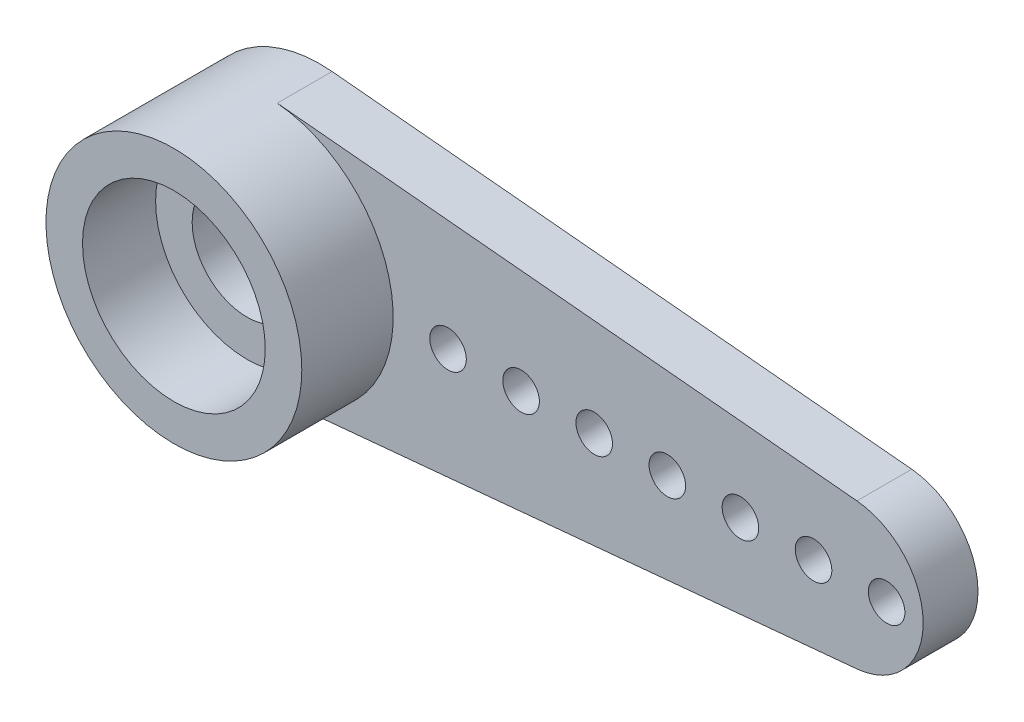
ISO-10303-21;
HEADER;
FILE_DESCRIPTION(('STEP AP214'),'2;1');
FILE_NAME('part.step','',(''),(''),'','','');
FILE_SCHEMA(('AUTOMOTIVE_DESIGN { 1 0 10303 214 1 1 1 1 }'));
ENDSEC;
DATA;
#1=APPLICATION_CONTEXT('core data for automotive mechanical design processes');
#2=APPLICATION_PROTOCOL_DEFINITION('international standard','automotive_design',2000,#1);
#3=PRODUCT_CONTEXT('',#1,'mechanical');
#4=PRODUCT('Part','Part','',(#3));
#5=PRODUCT_RELATED_PRODUCT_CATEGORY('part','',(#4));
#6=PRODUCT_DEFINITION_FORMATION('','',#4);
#7=PRODUCT_DEFINITION_CONTEXT('part definition',#1,'design');
#8=PRODUCT_DEFINITION('design','',#6,#7);
#9=PRODUCT_DEFINITION_SHAPE('','',#8);
#10=(LENGTH_UNIT() NAMED_UNIT(*) SI_UNIT(.MILLI.,.METRE.));
#11=(NAMED_UNIT(*) PLANE_ANGLE_UNIT() SI_UNIT($,.RADIAN.));
#12=(NAMED_UNIT(*) SI_UNIT($,.STERADIAN.) SOLID_ANGLE_UNIT());
#13=UNCERTAINTY_MEASURE_WITH_UNIT(LENGTH_MEASURE(1.E-05),#10,'distance_accuracy_value','');
#14=(GEOMETRIC_REPRESENTATION_CONTEXT(3) GLOBAL_UNCERTAINTY_ASSIGNED_CONTEXT((#13)) GLOBAL_UNIT_ASSIGNED_CONTEXT((#10,
#11,#12)) REPRESENTATION_CONTEXT('',''));
#15=CARTESIAN_POINT('',(0.,0.,0.));
#16=DIRECTION('',(0.,0.,1.));
#17=DIRECTION('',(1.,0.,0.));
#18=AXIS2_PLACEMENT_3D('',#15,#16,#17);
#19=CARTESIAN_POINT('',(0.,0.,-55.));
#20=DIRECTION('',(0.,0.,1.));
#21=DIRECTION('',(-1.,0.,0.));
#22=AXIS2_PLACEMENT_3D('',#19,#20,#21);
#23=CYLINDRICAL_SURFACE('',#22,1.5);
#24=CARTESIAN_POINT('',(0.,0.,-2.));
#25=DIRECTION('',(0.,0.,-1.));
#26=DIRECTION('',(-1.,0.,0.));
#27=AXIS2_PLACEMENT_3D('',#24,#25,#26);
#28=CIRCLE('',#27,1.5);
#29=CARTESIAN_POINT('',(-1.5,0.,-2.));
#30=VERTEX_POINT('',#29);
#31=EDGE_CURVE('E115',#30,#30,#28,.F.);
#32=ORIENTED_EDGE('',*,*,#31,.T.);
#33=EDGE_LOOP('',(#32));
#34=FACE_BOUND('',#33,.T.);
#35=CARTESIAN_POINT('',(0.,0.,-3.));
#36=DIRECTION('',(0.,0.,1.));
#37=DIRECTION('',(1.,0.,0.));
#38=AXIS2_PLACEMENT_3D('',#35,#36,#37);
#39=CIRCLE('',#38,1.5);
#40=CARTESIAN_POINT('',(1.5,0.,-3.));
#41=VERTEX_POINT('',#40);
#42=EDGE_CURVE('E41',#41,#41,#39,.F.);
#43=ORIENTED_EDGE('',*,*,#42,.T.);
#44=EDGE_LOOP('',(#43));
#45=FACE_BOUND('',#44,.T.);
#46=ADVANCED_FACE('F37',(#34,#45),#23,.F.);
#47=CARTESIAN_POINT('',(0.,0.,-4.));
#48=DIRECTION('',(0.,0.,1.));
#49=DIRECTION('',(-1.,0.,0.));
#50=AXIS2_PLACEMENT_3D('',#47,#48,#49);
#51=CYLINDRICAL_SURFACE('',#50,3.5);
#52=CARTESIAN_POINT('',(0.,0.,-4.));
#53=DIRECTION('',(0.,0.,1.));
#54=DIRECTION('',(1.,0.,0.));
#55=AXIS2_PLACEMENT_3D('',#52,#53,#54);
#56=CIRCLE('',#55,3.5);
#57=CARTESIAN_POINT('',(0.328125,3.48458519545369,-4.));
#58=VERTEX_POINT('',#57);
#59=CARTESIAN_POINT('',(0.328125,-3.48458519545369,-4.));
#60=VERTEX_POINT('',#59);
#61=EDGE_CURVE('E11',#58,#60,#56,.T.);
#62=ORIENTED_EDGE('',*,*,#61,.T.);
#63=DIRECTION('',(0.,0.,-1.));
#64=VECTOR('',#63,1.);
#65=CARTESIAN_POINT('',(0.328125,-3.48458519545369,-2.5));
#66=LINE('',#65,#64);
#67=CARTESIAN_POINT('',(0.328125,-3.48458519545369,-2.5));
#68=VERTEX_POINT('',#67);
#69=EDGE_CURVE('E98',#68,#60,#66,.T.);
#70=ORIENTED_EDGE('',*,*,#69,.F.);
#71=CARTESIAN_POINT('',(0.,0.,-2.5));
#72=DIRECTION('',(0.,0.,-1.));
#73=DIRECTION('',(1.,0.,0.));
#74=AXIS2_PLACEMENT_3D('',#71,#72,#73);
#75=CIRCLE('',#74,3.5);
#76=CARTESIAN_POINT('',(0.328125,3.48458519545369,-2.5));
#77=VERTEX_POINT('',#76);
#78=EDGE_CURVE('E89',#77,#68,#75,.T.);
#79=ORIENTED_EDGE('',*,*,#78,.F.);
#80=DIRECTION('',(0.,0.,-1.));
#81=VECTOR('',#80,1.);
#82=CARTESIAN_POINT('',(0.328125,3.48458519545369,-2.5));
#83=LINE('',#82,#81);
#84=EDGE_CURVE('E110',#77,#58,#83,.T.);
#85=ORIENTED_EDGE('',*,*,#84,.T.);
#86=EDGE_LOOP('',(#62,#70,#79,#85));
#87=FACE_BOUND('',#86,.T.);
#88=CARTESIAN_POINT('',(0.,0.,0.));
#89=DIRECTION('',(0.,0.,1.));
#90=DIRECTION('',(1.,0.,0.));
#91=AXIS2_PLACEMENT_3D('',#88,#89,#90);
#92=CIRCLE('',#91,3.5);
#93=CARTESIAN_POINT('',(3.5,0.,0.));
#94=VERTEX_POINT('',#93);
#95=EDGE_CURVE('E46',#94,#94,#92,.T.);
#96=ORIENTED_EDGE('',*,*,#95,.F.);
#97=EDGE_LOOP('',(#96));
#98=FACE_BOUND('',#97,.T.);
#99=ADVANCED_FACE('F39',(#87,#98),#51,.T.);
#100=CARTESIAN_POINT('',(0.,0.,-4.));
#101=DIRECTION('',(0.,0.,-1.));
#102=DIRECTION('',(1.,0.,0.));
#103=AXIS2_PLACEMENT_3D('',#100,#101,#102);
#104=PLANE('',#103);
#105=CARTESIAN_POINT('',(0.,0.,-4.));
#106=DIRECTION('',(0.,0.,1.));
#107=DIRECTION('',(1.,0.,0.));
#108=AXIS2_PLACEMENT_3D('',#105,#106,#107);
#109=CIRCLE('',#108,2.5);
#110=CARTESIAN_POINT('',(2.5,0.,-4.));
#111=VERTEX_POINT('',#110);
#112=EDGE_CURVE('E132',#111,#111,#109,.T.);
#113=ORIENTED_EDGE('',*,*,#112,.T.);
#114=EDGE_LOOP('',(#113));
#115=FACE_BOUND('',#114,.T.);
#116=CARTESIAN_POINT('',(17.,0.,-4.));
#117=DIRECTION('',(0.,0.,-1.));
#118=DIRECTION('',(-1.,0.,0.));
#119=AXIS2_PLACEMENT_3D('',#116,#117,#118);
#120=CIRCLE('',#119,0.500000000000002);
#121=CARTESIAN_POINT('',(16.5,0.,-4.));
#122=VERTEX_POINT('',#121);
#123=EDGE_CURVE('E122',#122,#122,#120,.T.);
#124=ORIENTED_EDGE('',*,*,#123,.F.);
#125=EDGE_LOOP('',(#124));
#126=FACE_BOUND('',#125,.T.);
#127=CARTESIAN_POINT('',(15.,0.,-4.));
#128=DIRECTION('',(0.,0.,-1.));
#129=DIRECTION('',(-1.,0.,0.));
#130=AXIS2_PLACEMENT_3D('',#127,#128,#129);
#131=CIRCLE('',#130,0.499999999999999);
#132=CARTESIAN_POINT('',(14.5,0.,-4.));
#133=VERTEX_POINT('',#132);
#134=EDGE_CURVE('E142',#133,#133,#131,.T.);
#135=ORIENTED_EDGE('',*,*,#134,.F.);
#136=EDGE_LOOP('',(#135));
#137=FACE_BOUND('',#136,.T.);
#138=CARTESIAN_POINT('',(5.,0.,-4.));
#139=DIRECTION('',(0.,0.,-1.));
#140=DIRECTION('',(-1.,0.,0.));
#141=AXIS2_PLACEMENT_3D('',#138,#139,#140);
#142=CIRCLE('',#141,0.500000000000001);
#143=CARTESIAN_POINT('',(4.5,0.,-4.));
#144=VERTEX_POINT('',#143);
#145=EDGE_CURVE('E135',#144,#144,#142,.T.);
#146=ORIENTED_EDGE('',*,*,#145,.F.);
#147=EDGE_LOOP('',(#146));
#148=FACE_BOUND('',#147,.T.);
#149=CARTESIAN_POINT('',(13.,0.,-4.));
#150=DIRECTION('',(0.,0.,-1.));
#151=DIRECTION('',(-1.,0.,0.));
#152=AXIS2_PLACEMENT_3D('',#149,#150,#151);
#153=CIRCLE('',#152,0.500000000000002);
#154=CARTESIAN_POINT('',(12.5,0.,-4.));
#155=VERTEX_POINT('',#154);
#156=EDGE_CURVE('E163',#155,#155,#153,.T.);
#157=ORIENTED_EDGE('',*,*,#156,.F.);
#158=EDGE_LOOP('',(#157));
#159=FACE_BOUND('',#158,.T.);
#160=CARTESIAN_POINT('',(11.,0.,-4.));
#161=DIRECTION('',(0.,0.,-1.));
#162=DIRECTION('',(-1.,0.,0.));
#163=AXIS2_PLACEMENT_3D('',#160,#161,#162);
#164=CIRCLE('',#163,0.499999999999999);
#165=CARTESIAN_POINT('',(10.5,0.,-4.));
#166=VERTEX_POINT('',#165);
#167=EDGE_CURVE('E157',#166,#166,#164,.T.);
#168=ORIENTED_EDGE('',*,*,#167,.F.);
#169=EDGE_LOOP('',(#168));
#170=FACE_BOUND('',#169,.T.);
#171=CARTESIAN_POINT('',(9.,0.,-4.));
#172=DIRECTION('',(0.,0.,-1.));
#173=DIRECTION('',(-1.,0.,0.));
#174=AXIS2_PLACEMENT_3D('',#171,#172,#173);
#175=CIRCLE('',#174,0.500000000000002);
#176=CARTESIAN_POINT('',(8.5,0.,-4.));
#177=VERTEX_POINT('',#176);
#178=EDGE_CURVE('E150',#177,#177,#175,.T.);
#179=ORIENTED_EDGE('',*,*,#178,.F.);
#180=EDGE_LOOP('',(#179));
#181=FACE_BOUND('',#180,.T.);
#182=CARTESIAN_POINT('',(7.,0.,-4.));
#183=DIRECTION('',(0.,0.,-1.));
#184=DIRECTION('',(-1.,0.,0.));
#185=AXIS2_PLACEMENT_3D('',#182,#183,#184);
#186=CIRCLE('',#185,0.500000000000001);
#187=CARTESIAN_POINT('',(6.5,0.,-4.));
#188=VERTEX_POINT('',#187);
#189=EDGE_CURVE('E107',#188,#188,#186,.T.);
#190=ORIENTED_EDGE('',*,*,#189,.F.);
#191=EDGE_LOOP('',(#190));
#192=FACE_BOUND('',#191,.T.);
#193=ORIENTED_EDGE('',*,*,#61,.F.);
#194=DIRECTION('',(-0.995595770129625,0.09375,0.));
#195=VECTOR('',#194,1.);
#196=CARTESIAN_POINT('',(0.328125,3.48458519545369,-4.));
#197=LINE('',#196,#195);
#198=CARTESIAN_POINT('',(16.1875,1.99119154025925,-4.));
#199=VERTEX_POINT('',#198);
#200=EDGE_CURVE('E54',#199,#58,#197,.T.);
#201=ORIENTED_EDGE('',*,*,#200,.F.);
#202=CARTESIAN_POINT('',(16.,0.,-4.));
#203=DIRECTION('',(0.,0.,1.));
#204=DIRECTION('',(1.,0.,0.));
#205=AXIS2_PLACEMENT_3D('',#202,#203,#204);
#206=CIRCLE('',#205,2.);
#207=CARTESIAN_POINT('',(16.1875,-1.99119154025925,-4.));
#208=VERTEX_POINT('',#207);
#209=EDGE_CURVE('E106',#208,#199,#206,.T.);
#210=ORIENTED_EDGE('',*,*,#209,.F.);
#211=DIRECTION('',(0.995595770129625,0.0937500000000001,0.));
#212=VECTOR('',#211,1.);
#213=CARTESIAN_POINT('',(16.1875,-1.99119154025925,-4.));
#214=LINE('',#213,#212);
#215=EDGE_CURVE('E95',#60,#208,#214,.T.);
#216=ORIENTED_EDGE('',*,*,#215,.F.);
#217=EDGE_LOOP('',(#193,#201,#210,#216));
#218=FACE_BOUND('',#217,.T.);
#219=ADVANCED_FACE('F194',(#115,#126,#137,#148,#159,#170,#181,#192,#218),#104,.T.);
#220=CARTESIAN_POINT('',(0.,0.,0.));
#221=DIRECTION('',(0.,0.,-1.));
#222=DIRECTION('',(1.,0.,0.));
#223=AXIS2_PLACEMENT_3D('',#220,#221,#222);
#224=PLANE('',#223);
#225=CARTESIAN_POINT('',(0.,0.,0.));
#226=DIRECTION('',(0.,0.,-1.));
#227=DIRECTION('',(-1.,0.,0.));
#228=AXIS2_PLACEMENT_3D('',#225,#226,#227);
#229=CIRCLE('',#228,2.5);
#230=CARTESIAN_POINT('',(-2.5,0.,0.));
#231=VERTEX_POINT('',#230);
#232=EDGE_CURVE('E125',#231,#231,#229,.T.);
#233=ORIENTED_EDGE('',*,*,#232,.T.);
#234=EDGE_LOOP('',(#233));
#235=FACE_BOUND('',#234,.T.);
#236=ORIENTED_EDGE('',*,*,#95,.T.);
#237=EDGE_LOOP('',(#236));
#238=FACE_BOUND('',#237,.T.);
#239=ADVANCED_FACE('F234',(#235,#238),#224,.F.);
#240=CARTESIAN_POINT('',(0.328125,3.48458519545369,-2.5));
#241=DIRECTION('',(0.09375,0.995595770129624,0.));
#242=DIRECTION('',(-0.995595770129625,0.09375,0.));
#243=AXIS2_PLACEMENT_3D('',#240,#241,#242);
#244=PLANE('',#243);
#245=ORIENTED_EDGE('',*,*,#200,.T.);
#246=ORIENTED_EDGE('',*,*,#84,.F.);
#247=DIRECTION('',(-0.995595770129625,0.09375,0.));
#248=VECTOR('',#247,1.);
#249=CARTESIAN_POINT('',(0.328125,3.48458519545369,-2.5));
#250=LINE('',#249,#248);
#251=CARTESIAN_POINT('',(16.1875,1.99119154025925,-2.5));
#252=VERTEX_POINT('',#251);
#253=EDGE_CURVE('E63',#252,#77,#250,.T.);
#254=ORIENTED_EDGE('',*,*,#253,.F.);
#255=DIRECTION('',(0.,0.,-1.));
#256=VECTOR('',#255,1.);
#257=CARTESIAN_POINT('',(16.1875,1.99119154025925,-2.5));
#258=LINE('',#257,#256);
#259=EDGE_CURVE('E76',#252,#199,#258,.T.);
#260=ORIENTED_EDGE('',*,*,#259,.T.);
#261=EDGE_LOOP('',(#245,#246,#254,#260));
#262=FACE_BOUND('',#261,.T.);
#263=ADVANCED_FACE('F245',(#262),#244,.T.);
#264=CARTESIAN_POINT('',(16.,0.,-2.5));
#265=DIRECTION('',(0.,0.,-1.));
#266=DIRECTION('',(1.,0.,0.));
#267=AXIS2_PLACEMENT_3D('',#264,#265,#266);
#268=CYLINDRICAL_SURFACE('',#267,2.);
#269=ORIENTED_EDGE('',*,*,#209,.T.);
#270=ORIENTED_EDGE('',*,*,#259,.F.);
#271=CARTESIAN_POINT('',(16.,0.,-2.5));
#272=DIRECTION('',(0.,0.,1.));
#273=DIRECTION('',(1.,0.,0.));
#274=AXIS2_PLACEMENT_3D('',#271,#272,#273);
#275=CIRCLE('',#274,2.);
#276=CARTESIAN_POINT('',(16.1875,-1.99119154025925,-2.5));
#277=VERTEX_POINT('',#276);
#278=EDGE_CURVE('E87',#277,#252,#275,.T.);
#279=ORIENTED_EDGE('',*,*,#278,.F.);
#280=DIRECTION('',(0.,0.,-1.));
#281=VECTOR('',#280,1.);
#282=CARTESIAN_POINT('',(16.1875,-1.99119154025925,-2.5));
#283=LINE('',#282,#281);
#284=EDGE_CURVE('E93',#277,#208,#283,.T.);
#285=ORIENTED_EDGE('',*,*,#284,.T.);
#286=EDGE_LOOP('',(#269,#270,#279,#285));
#287=FACE_BOUND('',#286,.T.);
#288=ADVANCED_FACE('F100',(#287),#268,.T.);
#289=CARTESIAN_POINT('',(16.1875,-1.99119154025925,-2.5));
#290=DIRECTION('',(0.09375,-0.995595770129624,0.));
#291=DIRECTION('',(0.995595770129625,0.0937500000000001,0.));
#292=AXIS2_PLACEMENT_3D('',#289,#290,#291);
#293=PLANE('',#292);
#294=ORIENTED_EDGE('',*,*,#215,.T.);
#295=ORIENTED_EDGE('',*,*,#284,.F.);
#296=DIRECTION('',(0.995595770129625,0.0937500000000001,0.));
#297=VECTOR('',#296,1.);
#298=CARTESIAN_POINT('',(16.1875,-1.99119154025925,-2.5));
#299=LINE('',#298,#297);
#300=EDGE_CURVE('E84',#68,#277,#299,.T.);
#301=ORIENTED_EDGE('',*,*,#300,.F.);
#302=ORIENTED_EDGE('',*,*,#69,.T.);
#303=EDGE_LOOP('',(#294,#295,#301,#302));
#304=FACE_BOUND('',#303,.T.);
#305=ADVANCED_FACE('F94',(#304),#293,.T.);
#306=CARTESIAN_POINT('',(0.,0.,-2.5));
#307=DIRECTION('',(0.,0.,-1.));
#308=DIRECTION('',(1.,0.,0.));
#309=AXIS2_PLACEMENT_3D('',#306,#307,#308);
#310=PLANE('',#309);
#311=CARTESIAN_POINT('',(17.,0.,-2.5));
#312=DIRECTION('',(0.,0.,-1.));
#313=DIRECTION('',(-1.,0.,0.));
#314=AXIS2_PLACEMENT_3D('',#311,#312,#313);
#315=CIRCLE('',#314,0.500000000000002);
#316=CARTESIAN_POINT('',(16.5,0.,-2.5));
#317=VERTEX_POINT('',#316);
#318=EDGE_CURVE('E117',#317,#317,#315,.T.);
#319=ORIENTED_EDGE('',*,*,#318,.T.);
#320=EDGE_LOOP('',(#319));
#321=FACE_BOUND('',#320,.T.);
#322=CARTESIAN_POINT('',(15.,0.,-2.5));
#323=DIRECTION('',(0.,0.,-1.));
#324=DIRECTION('',(-1.,0.,0.));
#325=AXIS2_PLACEMENT_3D('',#322,#323,#324);
#326=CIRCLE('',#325,0.499999999999999);
#327=CARTESIAN_POINT('',(14.5,0.,-2.5));
#328=VERTEX_POINT('',#327);
#329=EDGE_CURVE('E145',#328,#328,#326,.T.);
#330=ORIENTED_EDGE('',*,*,#329,.T.);
#331=EDGE_LOOP('',(#330));
#332=FACE_BOUND('',#331,.T.);
#333=CARTESIAN_POINT('',(5.,0.,-2.5));
#334=DIRECTION('',(0.,0.,-1.));
#335=DIRECTION('',(-1.,0.,0.));
#336=AXIS2_PLACEMENT_3D('',#333,#334,#335);
#337=CIRCLE('',#336,0.500000000000001);
#338=CARTESIAN_POINT('',(4.5,0.,-2.5));
#339=VERTEX_POINT('',#338);
#340=EDGE_CURVE('E139',#339,#339,#337,.T.);
#341=ORIENTED_EDGE('',*,*,#340,.T.);
#342=EDGE_LOOP('',(#341));
#343=FACE_BOUND('',#342,.T.);
#344=CARTESIAN_POINT('',(13.,0.,-2.5));
#345=DIRECTION('',(0.,0.,-1.));
#346=DIRECTION('',(-1.,0.,0.));
#347=AXIS2_PLACEMENT_3D('',#344,#345,#346);
#348=CIRCLE('',#347,0.500000000000002);
#349=CARTESIAN_POINT('',(12.5,0.,-2.5));
#350=VERTEX_POINT('',#349);
#351=EDGE_CURVE('E138',#350,#350,#348,.T.);
#352=ORIENTED_EDGE('',*,*,#351,.T.);
#353=EDGE_LOOP('',(#352));
#354=FACE_BOUND('',#353,.T.);
#355=CARTESIAN_POINT('',(11.,0.,-2.5));
#356=DIRECTION('',(0.,0.,-1.));
#357=DIRECTION('',(-1.,0.,0.));
#358=AXIS2_PLACEMENT_3D('',#355,#356,#357);
#359=CIRCLE('',#358,0.499999999999999);
#360=CARTESIAN_POINT('',(10.5,0.,-2.5));
#361=VERTEX_POINT('',#360);
#362=EDGE_CURVE('E160',#361,#361,#359,.T.);
#363=ORIENTED_EDGE('',*,*,#362,.T.);
#364=EDGE_LOOP('',(#363));
#365=FACE_BOUND('',#364,.T.);
#366=CARTESIAN_POINT('',(9.,0.,-2.5));
#367=DIRECTION('',(0.,0.,-1.));
#368=DIRECTION('',(-1.,0.,0.));
#369=AXIS2_PLACEMENT_3D('',#366,#367,#368);
#370=CIRCLE('',#369,0.500000000000002);
#371=CARTESIAN_POINT('',(8.5,0.,-2.5));
#372=VERTEX_POINT('',#371);
#373=EDGE_CURVE('E154',#372,#372,#370,.T.);
#374=ORIENTED_EDGE('',*,*,#373,.T.);
#375=EDGE_LOOP('',(#374));
#376=FACE_BOUND('',#375,.T.);
#377=CARTESIAN_POINT('',(7.,0.,-2.5));
#378=DIRECTION('',(0.,0.,-1.));
#379=DIRECTION('',(-1.,0.,0.));
#380=AXIS2_PLACEMENT_3D('',#377,#378,#379);
#381=CIRCLE('',#380,0.500000000000001);
#382=CARTESIAN_POINT('',(6.5,0.,-2.5));
#383=VERTEX_POINT('',#382);
#384=EDGE_CURVE('E153',#383,#383,#381,.T.);
#385=ORIENTED_EDGE('',*,*,#384,.T.);
#386=EDGE_LOOP('',(#385));
#387=FACE_BOUND('',#386,.T.);
#388=ORIENTED_EDGE('',*,*,#78,.T.);
#389=ORIENTED_EDGE('',*,*,#300,.T.);
#390=ORIENTED_EDGE('',*,*,#278,.T.);
#391=ORIENTED_EDGE('',*,*,#253,.T.);
#392=EDGE_LOOP('',(#388,#389,#390,#391));
#393=FACE_BOUND('',#392,.T.);
#394=ADVANCED_FACE('F85',(#321,#332,#343,#354,#365,#376,#387,#393),#310,.F.);
#395=CARTESIAN_POINT('',(7.,0.,-4.));
#396=DIRECTION('',(0.,0.,1.));
#397=DIRECTION('',(-1.,0.,0.));
#398=AXIS2_PLACEMENT_3D('',#395,#396,#397);
#399=CYLINDRICAL_SURFACE('',#398,0.500000000000001);
#400=ORIENTED_EDGE('',*,*,#189,.T.);
#401=EDGE_LOOP('',(#400));
#402=FACE_BOUND('',#401,.T.);
#403=ORIENTED_EDGE('',*,*,#384,.F.);
#404=EDGE_LOOP('',(#403));
#405=FACE_BOUND('',#404,.T.);
#406=ADVANCED_FACE('F174',(#402,#405),#399,.F.);
#407=CARTESIAN_POINT('',(9.,0.,-4.));
#408=DIRECTION('',(0.,0.,1.));
#409=DIRECTION('',(-1.,0.,0.));
#410=AXIS2_PLACEMENT_3D('',#407,#408,#409);
#411=CYLINDRICAL_SURFACE('',#410,0.500000000000002);
#412=ORIENTED_EDGE('',*,*,#178,.T.);
#413=EDGE_LOOP('',(#412));
#414=FACE_BOUND('',#413,.T.);
#415=ORIENTED_EDGE('',*,*,#373,.F.);
#416=EDGE_LOOP('',(#415));
#417=FACE_BOUND('',#416,.T.);
#418=ADVANCED_FACE('F176',(#414,#417),#411,.F.);
#419=CARTESIAN_POINT('',(11.,0.,-4.));
#420=DIRECTION('',(0.,0.,1.));
#421=DIRECTION('',(-1.,0.,0.));
#422=AXIS2_PLACEMENT_3D('',#419,#420,#421);
#423=CYLINDRICAL_SURFACE('',#422,0.499999999999999);
#424=ORIENTED_EDGE('',*,*,#167,.T.);
#425=EDGE_LOOP('',(#424));
#426=FACE_BOUND('',#425,.T.);
#427=ORIENTED_EDGE('',*,*,#362,.F.);
#428=EDGE_LOOP('',(#427));
#429=FACE_BOUND('',#428,.T.);
#430=ADVANCED_FACE('F183',(#426,#429),#423,.F.);
#431=CARTESIAN_POINT('',(13.,0.,-4.));
#432=DIRECTION('',(0.,0.,1.));
#433=DIRECTION('',(-1.,0.,0.));
#434=AXIS2_PLACEMENT_3D('',#431,#432,#433);
#435=CYLINDRICAL_SURFACE('',#434,0.500000000000002);
#436=ORIENTED_EDGE('',*,*,#156,.T.);
#437=EDGE_LOOP('',(#436));
#438=FACE_BOUND('',#437,.T.);
#439=ORIENTED_EDGE('',*,*,#351,.F.);
#440=EDGE_LOOP('',(#439));
#441=FACE_BOUND('',#440,.T.);
#442=ADVANCED_FACE('F205',(#438,#441),#435,.F.);
#443=CARTESIAN_POINT('',(5.,0.,-4.));
#444=DIRECTION('',(0.,0.,1.));
#445=DIRECTION('',(-1.,0.,0.));
#446=AXIS2_PLACEMENT_3D('',#443,#444,#445);
#447=CYLINDRICAL_SURFACE('',#446,0.500000000000001);
#448=ORIENTED_EDGE('',*,*,#145,.T.);
#449=EDGE_LOOP('',(#448));
#450=FACE_BOUND('',#449,.T.);
#451=ORIENTED_EDGE('',*,*,#340,.F.);
#452=EDGE_LOOP('',(#451));
#453=FACE_BOUND('',#452,.T.);
#454=ADVANCED_FACE('F201',(#450,#453),#447,.F.);
#455=CARTESIAN_POINT('',(15.,0.,-4.));
#456=DIRECTION('',(0.,0.,1.));
#457=DIRECTION('',(-1.,0.,0.));
#458=AXIS2_PLACEMENT_3D('',#455,#456,#457);
#459=CYLINDRICAL_SURFACE('',#458,0.499999999999999);
#460=ORIENTED_EDGE('',*,*,#134,.T.);
#461=EDGE_LOOP('',(#460));
#462=FACE_BOUND('',#461,.T.);
#463=ORIENTED_EDGE('',*,*,#329,.F.);
#464=EDGE_LOOP('',(#463));
#465=FACE_BOUND('',#464,.T.);
#466=ADVANCED_FACE('F204',(#462,#465),#459,.F.);
#467=CARTESIAN_POINT('',(17.,0.,-4.));
#468=DIRECTION('',(0.,0.,1.));
#469=DIRECTION('',(-1.,0.,0.));
#470=AXIS2_PLACEMENT_3D('',#467,#468,#469);
#471=CYLINDRICAL_SURFACE('',#470,0.500000000000002);
#472=ORIENTED_EDGE('',*,*,#123,.T.);
#473=EDGE_LOOP('',(#472));
#474=FACE_BOUND('',#473,.T.);
#475=ORIENTED_EDGE('',*,*,#318,.F.);
#476=EDGE_LOOP('',(#475));
#477=FACE_BOUND('',#476,.T.);
#478=ADVANCED_FACE('F209',(#474,#477),#471,.F.);
#479=CARTESIAN_POINT('',(0.,0.,-2.));
#480=DIRECTION('',(0.,0.,1.));
#481=DIRECTION('',(-1.,0.,0.));
#482=AXIS2_PLACEMENT_3D('',#479,#480,#481);
#483=PLANE('',#482);
#484=CARTESIAN_POINT('',(0.,0.,-2.));
#485=DIRECTION('',(0.,0.,-1.));
#486=DIRECTION('',(-1.,0.,0.));
#487=AXIS2_PLACEMENT_3D('',#484,#485,#486);
#488=CIRCLE('',#487,2.5);
#489=CARTESIAN_POINT('',(-2.5,0.,-2.));
#490=VERTEX_POINT('',#489);
#491=EDGE_CURVE('E118',#490,#490,#488,.T.);
#492=ORIENTED_EDGE('',*,*,#491,.F.);
#493=EDGE_LOOP('',(#492));
#494=FACE_BOUND('',#493,.T.);
#495=ORIENTED_EDGE('',*,*,#31,.F.);
#496=EDGE_LOOP('',(#495));
#497=FACE_BOUND('',#496,.T.);
#498=ADVANCED_FACE('F212',(#494,#497),#483,.T.);
#499=CARTESIAN_POINT('',(0.,0.,-2.));
#500=DIRECTION('',(0.,0.,1.));
#501=DIRECTION('',(-1.,0.,0.));
#502=AXIS2_PLACEMENT_3D('',#499,#500,#501);
#503=CYLINDRICAL_SURFACE('',#502,2.5);
#504=ORIENTED_EDGE('',*,*,#491,.T.);
#505=EDGE_LOOP('',(#504));
#506=FACE_BOUND('',#505,.T.);
#507=ORIENTED_EDGE('',*,*,#232,.F.);
#508=EDGE_LOOP('',(#507));
#509=FACE_BOUND('',#508,.T.);
#510=ADVANCED_FACE('F199',(#506,#509),#503,.F.);
#511=CARTESIAN_POINT('',(0.,0.,-3.));
#512=DIRECTION('',(0.,0.,-1.));
#513=DIRECTION('',(1.,0.,0.));
#514=AXIS2_PLACEMENT_3D('',#511,#512,#513);
#515=PLANE('',#514);
#516=CARTESIAN_POINT('',(0.,0.,-3.));
#517=DIRECTION('',(0.,0.,1.));
#518=DIRECTION('',(1.,0.,0.));
#519=AXIS2_PLACEMENT_3D('',#516,#517,#518);
#520=CIRCLE('',#519,2.5);
#521=CARTESIAN_POINT('',(2.5,0.,-3.));
#522=VERTEX_POINT('',#521);
#523=EDGE_CURVE('E344',#522,#522,#520,.T.);
#524=ORIENTED_EDGE('',*,*,#523,.F.);
#525=EDGE_LOOP('',(#524));
#526=FACE_BOUND('',#525,.T.);
#527=ORIENTED_EDGE('',*,*,#42,.F.);
#528=EDGE_LOOP('',(#527));
#529=FACE_BOUND('',#528,.T.);
#530=ADVANCED_FACE('F319',(#526,#529),#515,.T.);
#531=CARTESIAN_POINT('',(0.,0.,-3.));
#532=DIRECTION('',(0.,0.,-1.));
#533=DIRECTION('',(1.,0.,0.));
#534=AXIS2_PLACEMENT_3D('',#531,#532,#533);
#535=CYLINDRICAL_SURFACE('',#534,2.5);
#536=ORIENTED_EDGE('',*,*,#523,.T.);
#537=EDGE_LOOP('',(#536));
#538=FACE_BOUND('',#537,.T.);
#539=ORIENTED_EDGE('',*,*,#112,.F.);
#540=EDGE_LOOP('',(#539));
#541=FACE_BOUND('',#540,.T.);
#542=ADVANCED_FACE('F327',(#538,#541),#535,.F.);
#543=CLOSED_SHELL('',(#46,#99,#219,#239,#263,#288,#305,#394,#406,#418,#430,#442,#454,#466,#478,
#498,#510,#530,#542));
#544=MANIFOLD_SOLID_BREP('B2',#543);
#545=ADVANCED_BREP_SHAPE_REPRESENTATION('',(#18,#544),#14);
#546=SHAPE_DEFINITION_REPRESENTATION(#9,#545);
ENDSEC;
END-ISO-10303-21;
